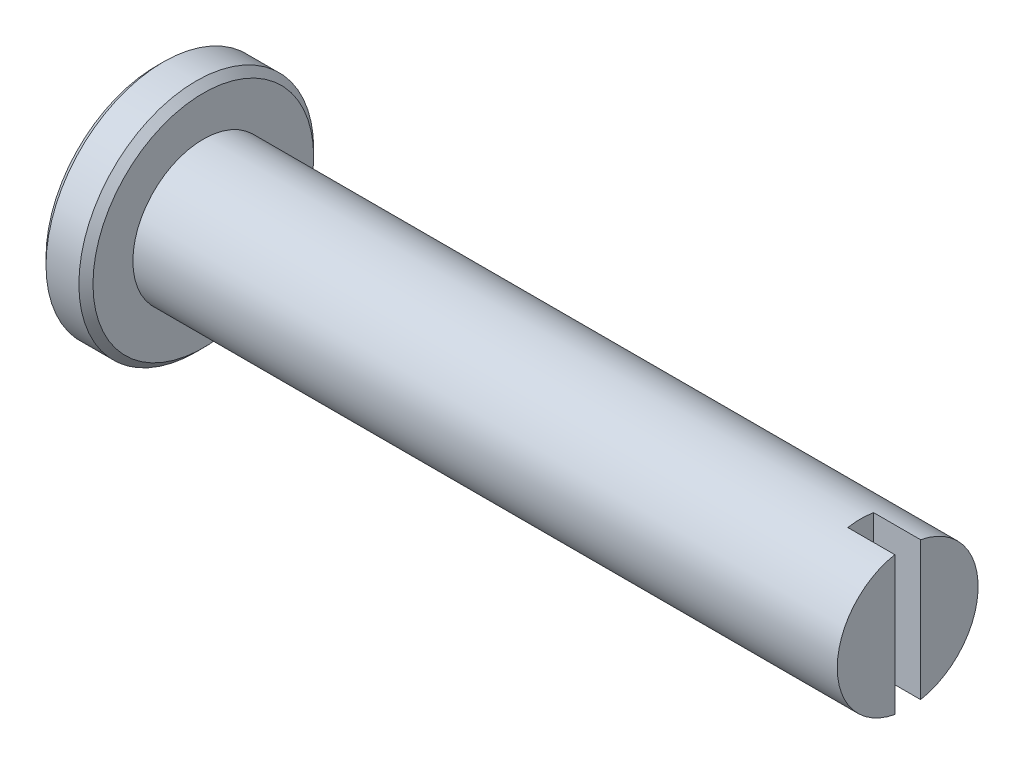
ISO-10303-21;
HEADER;
FILE_DESCRIPTION(('STEP AP214'),'2;1');
FILE_NAME('part.step','',(''),(''),'','','');
FILE_SCHEMA(('AUTOMOTIVE_DESIGN { 1 0 10303 214 1 1 1 1 }'));
ENDSEC;
DATA;
#1=APPLICATION_CONTEXT('core data for automotive mechanical design processes');
#2=APPLICATION_PROTOCOL_DEFINITION('international standard','automotive_design',2000,#1);
#3=PRODUCT_CONTEXT('',#1,'mechanical');
#4=PRODUCT('Part','Part','',(#3));
#5=PRODUCT_RELATED_PRODUCT_CATEGORY('part','',(#4));
#6=PRODUCT_DEFINITION_FORMATION('','',#4);
#7=PRODUCT_DEFINITION_CONTEXT('part definition',#1,'design');
#8=PRODUCT_DEFINITION('design','',#6,#7);
#9=PRODUCT_DEFINITION_SHAPE('','',#8);
#10=(LENGTH_UNIT() NAMED_UNIT(*) SI_UNIT(.MILLI.,.METRE.));
#11=(NAMED_UNIT(*) PLANE_ANGLE_UNIT() SI_UNIT($,.RADIAN.));
#12=(NAMED_UNIT(*) SI_UNIT($,.STERADIAN.) SOLID_ANGLE_UNIT());
#13=UNCERTAINTY_MEASURE_WITH_UNIT(LENGTH_MEASURE(1.E-05),#10,'distance_accuracy_value','');
#14=(GEOMETRIC_REPRESENTATION_CONTEXT(3) GLOBAL_UNCERTAINTY_ASSIGNED_CONTEXT((#13)) GLOBAL_UNIT_ASSIGNED_CONTEXT((#10,
#11,#12)) REPRESENTATION_CONTEXT('',''));
#15=CARTESIAN_POINT('',(0.,0.,0.));
#16=DIRECTION('',(0.,0.,1.));
#17=DIRECTION('',(1.,0.,0.));
#18=AXIS2_PLACEMENT_3D('',#15,#16,#17);
#19=CARTESIAN_POINT('',(32.,0.,0.));
#20=DIRECTION('',(-1.,0.,0.));
#21=DIRECTION('',(0.,0.,1.));
#22=AXIS2_PLACEMENT_3D('',#19,#20,#21);
#23=PLANE('',#22);
#24=CARTESIAN_POINT('',(32.,0.,0.));
#25=DIRECTION('',(-1.,0.,0.));
#26=DIRECTION('',(0.,0.,1.));
#27=AXIS2_PLACEMENT_3D('',#24,#25,#26);
#28=CIRCLE('',#27,3.);
#29=CARTESIAN_POINT('',(32.,2.94915242061172,-0.55));
#30=VERTEX_POINT('',#29);
#31=CARTESIAN_POINT('',(32.,-2.94915242061172,-0.55));
#32=VERTEX_POINT('',#31);
#33=EDGE_CURVE('E109',#30,#32,#28,.T.);
#34=ORIENTED_EDGE('',*,*,#33,.F.);
#35=DIRECTION('',(0.,1.,0.));
#36=VECTOR('',#35,1.);
#37=CARTESIAN_POINT('',(32.,-3.31864940053657,-0.55));
#38=LINE('',#37,#36);
#39=EDGE_CURVE('E102',#32,#30,#38,.T.);
#40=ORIENTED_EDGE('',*,*,#39,.F.);
#41=EDGE_LOOP('',(#34,#40));
#42=FACE_BOUND('',#41,.T.);
#43=ADVANCED_FACE('F50',(#42),#23,.F.);
#44=CARTESIAN_POINT('',(0.,0.,-5.));
#45=DIRECTION('',(1.,0.,0.));
#46=DIRECTION('',(0.,0.,-1.));
#47=AXIS2_PLACEMENT_3D('',#44,#45,#46);
#48=PLANE('',#47);
#49=CARTESIAN_POINT('',(0.,0.,0.));
#50=DIRECTION('',(1.,0.,0.));
#51=DIRECTION('',(0.,0.,-1.));
#52=AXIS2_PLACEMENT_3D('',#49,#50,#51);
#53=CIRCLE('',#52,4.7);
#54=CARTESIAN_POINT('',(0.,0.,-4.7));
#55=VERTEX_POINT('',#54);
#56=EDGE_CURVE('E132',#55,#55,#53,.F.);
#57=ORIENTED_EDGE('',*,*,#56,.T.);
#58=EDGE_LOOP('',(#57));
#59=FACE_BOUND('',#58,.T.);
#60=CARTESIAN_POINT('',(0.,0.,0.));
#61=DIRECTION('',(1.,0.,0.));
#62=DIRECTION('',(0.,0.,-1.));
#63=AXIS2_PLACEMENT_3D('',#60,#61,#62);
#64=CIRCLE('',#63,4.40000000000001);
#65=CARTESIAN_POINT('',(0.,0.,4.40000000000001));
#66=VERTEX_POINT('',#65);
#67=EDGE_CURVE('E129',#66,#66,#64,.T.);
#68=ORIENTED_EDGE('',*,*,#67,.T.);
#69=EDGE_LOOP('',(#68));
#70=FACE_BOUND('',#69,.T.);
#71=ADVANCED_FACE('F149',(#59,#70),#48,.F.);
#72=CARTESIAN_POINT('',(32.,-2.94915242061172,0.55));
#73=VERTEX_POINT('',#72);
#74=CARTESIAN_POINT('',(32.,2.94915242061172,0.55));
#75=VERTEX_POINT('',#74);
#76=EDGE_CURVE('E101',#73,#75,#28,.T.);
#77=ORIENTED_EDGE('',*,*,#76,.F.);
#78=DIRECTION('',(0.,-1.,0.));
#79=VECTOR('',#78,1.);
#80=CARTESIAN_POINT('',(32.,-3.31864940053657,0.55));
#81=LINE('',#80,#79);
#82=EDGE_CURVE('E92',#75,#73,#81,.T.);
#83=ORIENTED_EDGE('',*,*,#82,.F.);
#84=EDGE_LOOP('',(#77,#83));
#85=FACE_BOUND('',#84,.T.);
#86=ADVANCED_FACE('F100',(#85),#23,.F.);
#87=CARTESIAN_POINT('',(0.,0.,0.));
#88=DIRECTION('',(-1.,0.,0.));
#89=DIRECTION('',(0.,0.,1.));
#90=AXIS2_PLACEMENT_3D('',#87,#88,#89);
#91=CYLINDRICAL_SURFACE('',#90,3.);
#92=CARTESIAN_POINT('',(30.,0.,0.));
#93=DIRECTION('',(-1.,0.,0.));
#94=DIRECTION('',(0.,0.,1.));
#95=AXIS2_PLACEMENT_3D('',#92,#93,#94);
#96=CIRCLE('',#95,3.);
#97=CARTESIAN_POINT('',(30.,2.94915242061172,0.55));
#98=VERTEX_POINT('',#97);
#99=CARTESIAN_POINT('',(30.,2.94915242061172,-0.55));
#100=VERTEX_POINT('',#99);
#101=EDGE_CURVE('E70',#98,#100,#96,.T.);
#102=ORIENTED_EDGE('',*,*,#101,.T.);
#103=DIRECTION('',(-1.,0.,0.));
#104=VECTOR('',#103,1.);
#105=CARTESIAN_POINT('',(0.,2.94915242061172,-0.55));
#106=LINE('',#105,#104);
#107=EDGE_CURVE('E96',#100,#30,#106,.F.);
#108=ORIENTED_EDGE('',*,*,#107,.T.);
#109=ORIENTED_EDGE('',*,*,#33,.T.);
#110=DIRECTION('',(-1.,0.,0.));
#111=VECTOR('',#110,1.);
#112=CARTESIAN_POINT('',(0.,-2.94915242061172,-0.55));
#113=LINE('',#112,#111);
#114=CARTESIAN_POINT('',(30.,-2.94915242061172,-0.55));
#115=VERTEX_POINT('',#114);
#116=EDGE_CURVE('E121',#32,#115,#113,.T.);
#117=ORIENTED_EDGE('',*,*,#116,.T.);
#118=CARTESIAN_POINT('',(30.,-2.94915242061172,0.55));
#119=VERTEX_POINT('',#118);
#120=EDGE_CURVE('E113',#115,#119,#96,.T.);
#121=ORIENTED_EDGE('',*,*,#120,.T.);
#122=DIRECTION('',(-1.,0.,0.));
#123=VECTOR('',#122,1.);
#124=CARTESIAN_POINT('',(0.,-2.94915242061172,0.55));
#125=LINE('',#124,#123);
#126=EDGE_CURVE('E108',#119,#73,#125,.F.);
#127=ORIENTED_EDGE('',*,*,#126,.T.);
#128=ORIENTED_EDGE('',*,*,#76,.T.);
#129=DIRECTION('',(-1.,0.,0.));
#130=VECTOR('',#129,1.);
#131=CARTESIAN_POINT('',(0.,2.94915242061172,0.55));
#132=LINE('',#131,#130);
#133=EDGE_CURVE('E89',#75,#98,#132,.T.);
#134=ORIENTED_EDGE('',*,*,#133,.T.);
#135=EDGE_LOOP('',(#102,#108,#109,#117,#121,#127,#128,#134));
#136=FACE_BOUND('',#135,.T.);
#137=CARTESIAN_POINT('',(2.,0.,0.));
#138=DIRECTION('',(-1.,0.,0.));
#139=DIRECTION('',(0.,0.,1.));
#140=AXIS2_PLACEMENT_3D('',#137,#138,#139);
#141=CIRCLE('',#140,3.);
#142=CARTESIAN_POINT('',(2.,0.,3.));
#143=VERTEX_POINT('',#142);
#144=EDGE_CURVE('E110',#143,#143,#141,.T.);
#145=ORIENTED_EDGE('',*,*,#144,.F.);
#146=EDGE_LOOP('',(#145));
#147=FACE_BOUND('',#146,.T.);
#148=ADVANCED_FACE('F105',(#136,#147),#91,.T.);
#149=CARTESIAN_POINT('',(2.,0.,-3.));
#150=DIRECTION('',(-1.,0.,0.));
#151=DIRECTION('',(0.,0.,1.));
#152=AXIS2_PLACEMENT_3D('',#149,#150,#151);
#153=PLANE('',#152);
#154=CARTESIAN_POINT('',(2.,0.,0.));
#155=DIRECTION('',(-1.,0.,0.));
#156=DIRECTION('',(0.,0.,1.));
#157=AXIS2_PLACEMENT_3D('',#154,#155,#156);
#158=CIRCLE('',#157,4.7);
#159=CARTESIAN_POINT('',(2.,0.,4.7));
#160=VERTEX_POINT('',#159);
#161=EDGE_CURVE('E13',#160,#160,#158,.F.);
#162=ORIENTED_EDGE('',*,*,#161,.T.);
#163=EDGE_LOOP('',(#162));
#164=FACE_BOUND('',#163,.T.);
#165=ORIENTED_EDGE('',*,*,#144,.T.);
#166=EDGE_LOOP('',(#165));
#167=FACE_BOUND('',#166,.T.);
#168=ADVANCED_FACE('F187',(#164,#167),#153,.F.);
#169=CARTESIAN_POINT('',(0.,0.,0.));
#170=DIRECTION('',(-1.,0.,0.));
#171=DIRECTION('',(0.,0.,1.));
#172=AXIS2_PLACEMENT_3D('',#169,#170,#171);
#173=CYLINDRICAL_SURFACE('',#172,5.);
#174=CARTESIAN_POINT('',(0.300000000000001,0.,0.));
#175=DIRECTION('',(1.,0.,0.));
#176=DIRECTION('',(0.,0.,-1.));
#177=AXIS2_PLACEMENT_3D('',#174,#175,#176);
#178=CIRCLE('',#177,5.);
#179=CARTESIAN_POINT('',(0.300000000000001,0.,5.));
#180=VERTEX_POINT('',#179);
#181=EDGE_CURVE('E58',#180,#180,#178,.T.);
#182=CARTESIAN_POINT('',(1.7,0.,0.));
#183=DIRECTION('',(-1.,0.,0.));
#184=DIRECTION('',(0.,0.,1.));
#185=AXIS2_PLACEMENT_3D('',#182,#183,#184);
#186=CIRCLE('',#185,5.);
#187=CARTESIAN_POINT('',(1.7,0.,5.));
#188=VERTEX_POINT('',#187);
#189=EDGE_CURVE('E135',#188,#188,#186,.T.);
#190=CARTESIAN_POINT('',(0.300000000000001,0.,5.));
#191=CARTESIAN_POINT('',(0.314583333333334,0.,5.));
#192=CARTESIAN_POINT('',(0.329166666666667,0.,5.));
#193=CARTESIAN_POINT('',(0.358333333333334,0.,5.));
#194=CARTESIAN_POINT('',(0.372916666666667,0.,5.));
#195=CARTESIAN_POINT('',(0.402083333333334,0.,5.));
#196=CARTESIAN_POINT('',(0.416666666666667,0.,5.));
#197=CARTESIAN_POINT('',(0.445833333333334,0.,5.));
#198=CARTESIAN_POINT('',(0.460416666666667,0.,5.));
#199=CARTESIAN_POINT('',(0.489583333333334,0.,5.));
#200=CARTESIAN_POINT('',(0.504166666666667,0.,5.));
#201=CARTESIAN_POINT('',(0.533333333333334,0.,5.));
#202=CARTESIAN_POINT('',(0.547916666666667,0.,5.));
#203=CARTESIAN_POINT('',(0.577083333333334,0.,5.));
#204=CARTESIAN_POINT('',(0.591666666666667,0.,5.));
#205=CARTESIAN_POINT('',(0.620833333333334,0.,5.));
#206=CARTESIAN_POINT('',(0.635416666666667,0.,5.));
#207=CARTESIAN_POINT('',(0.664583333333334,0.,5.));
#208=CARTESIAN_POINT('',(0.679166666666667,0.,5.));
#209=CARTESIAN_POINT('',(0.708333333333334,0.,5.));
#210=CARTESIAN_POINT('',(0.722916666666667,0.,5.));
#211=CARTESIAN_POINT('',(0.752083333333334,0.,5.));
#212=CARTESIAN_POINT('',(0.766666666666667,0.,5.));
#213=CARTESIAN_POINT('',(0.795833333333334,0.,5.));
#214=CARTESIAN_POINT('',(0.810416666666667,0.,5.));
#215=CARTESIAN_POINT('',(0.839583333333334,0.,5.));
#216=CARTESIAN_POINT('',(0.854166666666667,0.,5.));
#217=CARTESIAN_POINT('',(0.883333333333334,0.,5.));
#218=CARTESIAN_POINT('',(0.897916666666667,0.,5.));
#219=CARTESIAN_POINT('',(0.927083333333334,0.,5.));
#220=CARTESIAN_POINT('',(0.941666666666667,0.,5.));
#221=CARTESIAN_POINT('',(0.970833333333334,0.,5.));
#222=CARTESIAN_POINT('',(0.985416666666667,0.,5.));
#223=CARTESIAN_POINT('',(1.01458333333333,0.,5.));
#224=CARTESIAN_POINT('',(1.02916666666667,0.,5.));
#225=CARTESIAN_POINT('',(1.05833333333333,0.,5.));
#226=CARTESIAN_POINT('',(1.07291666666667,0.,5.));
#227=CARTESIAN_POINT('',(1.10208333333333,0.,5.));
#228=CARTESIAN_POINT('',(1.11666666666667,0.,5.));
#229=CARTESIAN_POINT('',(1.14583333333333,0.,5.));
#230=CARTESIAN_POINT('',(1.16041666666667,0.,5.));
#231=CARTESIAN_POINT('',(1.18958333333333,0.,5.));
#232=CARTESIAN_POINT('',(1.20416666666667,0.,5.));
#233=CARTESIAN_POINT('',(1.23333333333333,0.,5.));
#234=CARTESIAN_POINT('',(1.24791666666667,0.,5.));
#235=CARTESIAN_POINT('',(1.27708333333333,0.,5.));
#236=CARTESIAN_POINT('',(1.29166666666667,0.,5.));
#237=CARTESIAN_POINT('',(1.32083333333333,0.,5.));
#238=CARTESIAN_POINT('',(1.33541666666667,0.,5.));
#239=CARTESIAN_POINT('',(1.36458333333333,0.,5.));
#240=CARTESIAN_POINT('',(1.37916666666667,0.,5.));
#241=CARTESIAN_POINT('',(1.40833333333333,0.,5.));
#242=CARTESIAN_POINT('',(1.42291666666667,0.,5.));
#243=CARTESIAN_POINT('',(1.45208333333333,0.,5.));
#244=CARTESIAN_POINT('',(1.46666666666667,0.,5.));
#245=CARTESIAN_POINT('',(1.49583333333333,0.,5.));
#246=CARTESIAN_POINT('',(1.51041666666667,0.,5.));
#247=CARTESIAN_POINT('',(1.53958333333333,0.,5.));
#248=CARTESIAN_POINT('',(1.55416666666667,0.,5.));
#249=CARTESIAN_POINT('',(1.58333333333333,0.,5.));
#250=CARTESIAN_POINT('',(1.59791666666667,0.,5.));
#251=CARTESIAN_POINT('',(1.62708333333333,0.,5.));
#252=CARTESIAN_POINT('',(1.64166666666667,0.,5.));
#253=CARTESIAN_POINT('',(1.67083333333333,0.,5.));
#254=CARTESIAN_POINT('',(1.68541666666667,0.,5.));
#255=CARTESIAN_POINT('',(1.7,0.,5.));
#256=B_SPLINE_CURVE_WITH_KNOTS('',3,(#190,#191,#192,#193,#194,#195,#196,#197,#198,#199,#200,
#201,#202,#203,#204,#205,#206,#207,#208,#209,#210,#211,#212,#213,#214,#215,#216,#217,#218,#219,
#220,#221,#222,#223,#224,#225,#226,#227,#228,#229,#230,#231,#232,#233,#234,#235,#236,#237,#238,
#239,#240,#241,#242,#243,#244,#245,#246,#247,#248,#249,#250,#251,#252,#253,#254,#255),
.UNSPECIFIED.,.F.,.F.,(4,2,2,2,2,2,2,2,2,2,2,2,2,2,2,2,2,2,2,2,2,2,2,2,2,2,2,2,2,2,2,2,4),(0.,
0.04375,0.0875,0.13125,0.175,0.21875,0.2625,0.30625,0.35,0.39375,0.4375,0.48125,0.525,0.56875,
0.6125,0.65625,0.7,0.74375,0.7875,0.831249999999999,0.874999999999999,0.918749999999999,0.9625,
1.00625,1.05,1.09375,1.1375,1.18125,1.225,1.26875,1.3125,1.35625,1.4),.UNSPECIFIED.);
#257=EDGE_CURVE('BSEAM140',#180,#188,#256,.T.);
#258=ORIENTED_EDGE('',*,*,#181,.T.);
#259=ORIENTED_EDGE('',*,*,#189,.T.);
#260=ORIENTED_EDGE('',*,*,#257,.T.);
#261=ORIENTED_EDGE('',*,*,#257,.F.);
#262=EDGE_LOOP('',(#258,#260,#259,#261));
#263=FACE_BOUND('',#262,.T.);
#264=ADVANCED_FACE('F140',(#263),#173,.T.);
#265=CARTESIAN_POINT('',(30.,-3.31864940053657,-0.55));
#266=DIRECTION('',(0.,0.,-1.));
#267=DIRECTION('',(-1.,0.,0.));
#268=AXIS2_PLACEMENT_3D('',#265,#266,#267);
#269=PLANE('',#268);
#270=ORIENTED_EDGE('',*,*,#39,.T.);
#271=ORIENTED_EDGE('',*,*,#107,.F.);
#272=DIRECTION('',(0.,1.,0.));
#273=VECTOR('',#272,1.);
#274=CARTESIAN_POINT('',(30.,-3.31864940053657,-0.55));
#275=LINE('',#274,#273);
#276=EDGE_CURVE('E115',#115,#100,#275,.T.);
#277=ORIENTED_EDGE('',*,*,#276,.F.);
#278=ORIENTED_EDGE('',*,*,#116,.F.);
#279=EDGE_LOOP('',(#270,#271,#277,#278));
#280=FACE_BOUND('',#279,.T.);
#281=ADVANCED_FACE('F174',(#280),#269,.F.);
#282=CARTESIAN_POINT('',(30.,-3.31864940053657,0.55));
#283=DIRECTION('',(0.,0.,1.));
#284=DIRECTION('',(1.,0.,0.));
#285=AXIS2_PLACEMENT_3D('',#282,#283,#284);
#286=PLANE('',#285);
#287=ORIENTED_EDGE('',*,*,#82,.T.);
#288=ORIENTED_EDGE('',*,*,#126,.F.);
#289=DIRECTION('',(0.,-1.,0.));
#290=VECTOR('',#289,1.);
#291=CARTESIAN_POINT('',(30.,-3.31864940053657,0.55));
#292=LINE('',#291,#290);
#293=EDGE_CURVE('E65',#98,#119,#292,.T.);
#294=ORIENTED_EDGE('',*,*,#293,.F.);
#295=ORIENTED_EDGE('',*,*,#133,.F.);
#296=EDGE_LOOP('',(#287,#288,#294,#295));
#297=FACE_BOUND('',#296,.T.);
#298=ADVANCED_FACE('F91',(#297),#286,.F.);
#299=CARTESIAN_POINT('',(30.,0.,0.));
#300=DIRECTION('',(-1.,0.,0.));
#301=DIRECTION('',(0.,0.,1.));
#302=AXIS2_PLACEMENT_3D('',#299,#300,#301);
#303=PLANE('',#302);
#304=ORIENTED_EDGE('',*,*,#293,.T.);
#305=ORIENTED_EDGE('',*,*,#120,.F.);
#306=ORIENTED_EDGE('',*,*,#276,.T.);
#307=ORIENTED_EDGE('',*,*,#101,.F.);
#308=EDGE_LOOP('',(#304,#305,#306,#307));
#309=FACE_BOUND('',#308,.T.);
#310=ADVANCED_FACE('F164',(#309),#303,.F.);
#311=CARTESIAN_POINT('',(2.,0.,0.));
#312=DIRECTION('',(-1.,0.,0.));
#313=DIRECTION('',(0.,0.,1.));
#314=AXIS2_PLACEMENT_3D('',#311,#312,#313);
#315=CYLINDRICAL_SURFACE('',#314,1.);
#316=CARTESIAN_POINT('',(1.96299091524472,0.,0.));
#317=DIRECTION('',(1.,0.,0.));
#318=DIRECTION('',(0.,0.,-1.));
#319=AXIS2_PLACEMENT_3D('',#316,#317,#318);
#320=CIRCLE('',#319,1.);
#321=CARTESIAN_POINT('',(1.96299091524472,0.,1.));
#322=VERTEX_POINT('',#321);
#323=EDGE_CURVE('E126',#322,#322,#320,.F.);
#324=ORIENTED_EDGE('',*,*,#323,.T.);
#325=EDGE_LOOP('',(#324));
#326=FACE_BOUND('',#325,.T.);
#327=CARTESIAN_POINT('',(2.,0.,0.));
#328=DIRECTION('',(-1.,0.,0.));
#329=DIRECTION('',(0.,0.,1.));
#330=AXIS2_PLACEMENT_3D('',#327,#328,#329);
#331=CIRCLE('',#330,1.);
#332=CARTESIAN_POINT('',(2.,0.,1.));
#333=VERTEX_POINT('',#332);
#334=EDGE_CURVE('E103',#333,#333,#331,.T.);
#335=ORIENTED_EDGE('',*,*,#334,.F.);
#336=EDGE_LOOP('',(#335));
#337=FACE_BOUND('',#336,.T.);
#338=ADVANCED_FACE('F161',(#326,#337),#315,.F.);
#339=CARTESIAN_POINT('',(2.,0.,0.));
#340=DIRECTION('',(-1.,0.,0.));
#341=DIRECTION('',(0.,0.,1.));
#342=AXIS2_PLACEMENT_3D('',#339,#340,#341);
#343=PLANE('',#342);
#344=ORIENTED_EDGE('',*,*,#334,.T.);
#345=EDGE_LOOP('',(#344));
#346=FACE_BOUND('',#345,.T.);
#347=ADVANCED_FACE('F157',(#346),#343,.T.);
#348=CARTESIAN_POINT('',(1.96299091524472,0.,0.));
#349=DIRECTION('',(-1.,0.,0.));
#350=DIRECTION('',(0.,0.,1.));
#351=AXIS2_PLACEMENT_3D('',#348,#349,#350);
#352=CONICAL_SURFACE('',#351,1.,1.0471975511966);
#353=CARTESIAN_POINT('',(0.,0.,4.40000000000001));
#354=CARTESIAN_POINT('',(0.0204478220337992,0.,4.36458333333334));
#355=CARTESIAN_POINT('',(0.0408956440675984,0.,4.32916666666668));
#356=CARTESIAN_POINT('',(0.0817912881351969,0.,4.25833333333334));
#357=CARTESIAN_POINT('',(0.102239110168996,0.,4.22291666666668));
#358=CARTESIAN_POINT('',(0.143134754236595,0.,4.15208333333334));
#359=CARTESIAN_POINT('',(0.163582576270394,0.,4.11666666666668));
#360=CARTESIAN_POINT('',(0.204478220337992,0.,4.04583333333334));
#361=CARTESIAN_POINT('',(0.224926042371791,0.,4.01041666666668));
#362=CARTESIAN_POINT('',(0.26582168643939,0.,3.93958333333334));
#363=CARTESIAN_POINT('',(0.286269508473189,0.,3.90416666666668));
#364=CARTESIAN_POINT('',(0.327165152540787,0.,3.83333333333334));
#365=CARTESIAN_POINT('',(0.347612974574587,0.,3.79791666666668));
#366=CARTESIAN_POINT('',(0.388508618642185,0.,3.72708333333334));
#367=CARTESIAN_POINT('',(0.408956440675984,0.,3.69166666666668));
#368=CARTESIAN_POINT('',(0.449852084743583,0.,3.62083333333334));
#369=CARTESIAN_POINT('',(0.470299906777382,0.,3.58541666666668));
#370=CARTESIAN_POINT('',(0.51119555084498,0.,3.51458333333334));
#371=CARTESIAN_POINT('',(0.53164337287878,0.,3.47916666666667));
#372=CARTESIAN_POINT('',(0.572539016946378,0.,3.40833333333334));
#373=CARTESIAN_POINT('',(0.592986838980177,0.,3.37291666666667));
#374=CARTESIAN_POINT('',(0.633882483047776,0.,3.30208333333334));
#375=CARTESIAN_POINT('',(0.654330305081575,0.,3.26666666666667));
#376=CARTESIAN_POINT('',(0.695225949149173,0.,3.19583333333334));
#377=CARTESIAN_POINT('',(0.715673771182973,0.,3.16041666666667));
#378=CARTESIAN_POINT('',(0.756569415250571,0.,3.08958333333334));
#379=CARTESIAN_POINT('',(0.77701723728437,0.,3.05416666666667));
#380=CARTESIAN_POINT('',(0.817912881351969,0.,2.98333333333334));
#381=CARTESIAN_POINT('',(0.838360703385768,0.,2.94791666666667));
#382=CARTESIAN_POINT('',(0.879256347453366,0.,2.87708333333334));
#383=CARTESIAN_POINT('',(0.899704169487166,0.,2.84166666666667));
#384=CARTESIAN_POINT('',(0.940599813554764,0.,2.77083333333334));
#385=CARTESIAN_POINT('',(0.961047635588563,0.,2.73541666666667));
#386=CARTESIAN_POINT('',(1.00194327965616,0.,2.66458333333334));
#387=CARTESIAN_POINT('',(1.02239110168996,0.,2.62916666666667));
#388=CARTESIAN_POINT('',(1.06328674575756,0.,2.55833333333334));
#389=CARTESIAN_POINT('',(1.08373456779136,0.,2.52291666666667));
#390=CARTESIAN_POINT('',(1.12463021185896,0.,2.45208333333334));
#391=CARTESIAN_POINT('',(1.14507803389276,0.,2.41666666666667));
#392=CARTESIAN_POINT('',(1.18597367796035,0.,2.34583333333334));
#393=CARTESIAN_POINT('',(1.20642149999415,0.,2.31041666666667));
#394=CARTESIAN_POINT('',(1.24731714406175,0.,2.23958333333334));
#395=CARTESIAN_POINT('',(1.26776496609555,0.,2.20416666666667));
#396=CARTESIAN_POINT('',(1.30866061016315,0.,2.13333333333334));
#397=CARTESIAN_POINT('',(1.32910843219695,0.,2.09791666666667));
#398=CARTESIAN_POINT('',(1.37000407626455,0.,2.02708333333334));
#399=CARTESIAN_POINT('',(1.39045189829835,0.,1.99166666666667));
#400=CARTESIAN_POINT('',(1.43134754236595,0.,1.92083333333334));
#401=CARTESIAN_POINT('',(1.45179536439974,0.,1.88541666666667));
#402=CARTESIAN_POINT('',(1.49269100846734,0.,1.81458333333334));
#403=CARTESIAN_POINT('',(1.51313883050114,0.,1.77916666666667));
#404=CARTESIAN_POINT('',(1.55403447456874,0.,1.70833333333334));
#405=CARTESIAN_POINT('',(1.57448229660254,0.,1.67291666666667));
#406=CARTESIAN_POINT('',(1.61537794067014,0.,1.60208333333334));
#407=CARTESIAN_POINT('',(1.63582576270394,0.,1.56666666666667));
#408=CARTESIAN_POINT('',(1.67672140677154,0.,1.49583333333334));
#409=CARTESIAN_POINT('',(1.69716922880534,0.,1.46041666666667));
#410=CARTESIAN_POINT('',(1.73806487287293,0.,1.38958333333333));
#411=CARTESIAN_POINT('',(1.75851269490673,0.,1.35416666666667));
#412=CARTESIAN_POINT('',(1.79940833897433,0.,1.28333333333333));
#413=CARTESIAN_POINT('',(1.81985616100813,0.,1.24791666666667));
#414=CARTESIAN_POINT('',(1.86075180507573,0.,1.17708333333333));
#415=CARTESIAN_POINT('',(1.88119962710953,0.,1.14166666666667));
#416=CARTESIAN_POINT('',(1.92209527117713,0.,1.07083333333333));
#417=CARTESIAN_POINT('',(1.94254309321093,0.,1.03541666666667));
#418=CARTESIAN_POINT('',(1.96299091524472,0.,1.));
#419=B_SPLINE_CURVE_WITH_KNOTS('',3,(#353,#354,#355,#356,#357,#358,#359,#360,#361,#362,#363,
#364,#365,#366,#367,#368,#369,#370,#371,#372,#373,#374,#375,#376,#377,#378,#379,#380,#381,#382,
#383,#384,#385,#386,#387,#388,#389,#390,#391,#392,#393,#394,#395,#396,#397,#398,#399,#400,#401,
#402,#403,#404,#405,#406,#407,#408,#409,#410,#411,#412,#413,#414,#415,#416,#417,#418),
.UNSPECIFIED.,.F.,.F.,(4,2,2,2,2,2,2,2,2,2,2,2,2,2,2,2,2,2,2,2,2,2,2,2,2,2,2,2,2,2,2,2,4),(0.,
0.122686932202796,0.245373864405592,0.368060796608387,0.490747728811182,0.613434661013978,
0.736121593216774,0.85880852541957,0.981495457622366,1.10418238982516,1.22686932202796,
1.34955625423075,1.47224318643355,1.59493011863634,1.71761705083914,1.84030398304194,
1.96299091524473,2.08567784744753,2.20836477965032,2.33105171185312,2.45373864405591,
2.57642557625871,2.69911250846151,2.8217994406643,2.9444863728671,3.06717330506989,
3.18986023727269,3.31254716947548,3.43523410167828,3.55792103388108,3.68060796608387,
3.80329489828667,3.92598183048946),.UNSPECIFIED.);
#420=EDGE_CURVE('BSEAM146',#66,#322,#419,.T.);
#421=ORIENTED_EDGE('',*,*,#67,.F.);
#422=ORIENTED_EDGE('',*,*,#323,.F.);
#423=ORIENTED_EDGE('',*,*,#420,.T.);
#424=ORIENTED_EDGE('',*,*,#420,.F.);
#425=EDGE_LOOP('',(#421,#423,#422,#424));
#426=FACE_BOUND('',#425,.T.);
#427=ADVANCED_FACE('F146',(#426),#352,.F.);
#428=CARTESIAN_POINT('',(0.,0.,0.));
#429=DIRECTION('',(1.,0.,0.));
#430=DIRECTION('',(0.,0.,-1.));
#431=AXIS2_PLACEMENT_3D('',#428,#429,#430);
#432=CONICAL_SURFACE('',#431,4.7,0.785398163397454);
#433=ORIENTED_EDGE('',*,*,#181,.F.);
#434=EDGE_LOOP('',(#433));
#435=FACE_BOUND('',#434,.T.);
#436=ORIENTED_EDGE('',*,*,#56,.F.);
#437=EDGE_LOOP('',(#436));
#438=FACE_BOUND('',#437,.T.);
#439=ADVANCED_FACE('F143',(#435,#438),#432,.T.);
#440=CARTESIAN_POINT('',(1.7,0.,0.));
#441=DIRECTION('',(-1.,0.,0.));
#442=DIRECTION('',(0.,0.,1.));
#443=AXIS2_PLACEMENT_3D('',#440,#441,#442);
#444=CONICAL_SURFACE('',#443,5.,0.785398163397443);
#445=CARTESIAN_POINT('',(2.,0.,4.7));
#446=CARTESIAN_POINT('',(1.996875,0.,4.703125));
#447=CARTESIAN_POINT('',(1.99375,0.,4.70625));
#448=CARTESIAN_POINT('',(1.9875,0.,4.7125));
#449=CARTESIAN_POINT('',(1.984375,0.,4.715625));
#450=CARTESIAN_POINT('',(1.978125,0.,4.721875));
#451=CARTESIAN_POINT('',(1.975,0.,4.725));
#452=CARTESIAN_POINT('',(1.96875,0.,4.73125));
#453=CARTESIAN_POINT('',(1.965625,0.,4.734375));
#454=CARTESIAN_POINT('',(1.959375,0.,4.740625));
#455=CARTESIAN_POINT('',(1.95625,0.,4.74375));
#456=CARTESIAN_POINT('',(1.95,0.,4.75));
#457=CARTESIAN_POINT('',(1.946875,0.,4.753125));
#458=CARTESIAN_POINT('',(1.940625,0.,4.759375));
#459=CARTESIAN_POINT('',(1.9375,0.,4.7625));
#460=CARTESIAN_POINT('',(1.93125,0.,4.76875));
#461=CARTESIAN_POINT('',(1.928125,0.,4.771875));
#462=CARTESIAN_POINT('',(1.921875,0.,4.778125));
#463=CARTESIAN_POINT('',(1.91875,0.,4.78125));
#464=CARTESIAN_POINT('',(1.9125,0.,4.7875));
#465=CARTESIAN_POINT('',(1.909375,0.,4.790625));
#466=CARTESIAN_POINT('',(1.903125,0.,4.796875));
#467=CARTESIAN_POINT('',(1.9,0.,4.8));
#468=CARTESIAN_POINT('',(1.89375,0.,4.80625));
#469=CARTESIAN_POINT('',(1.890625,0.,4.809375));
#470=CARTESIAN_POINT('',(1.884375,0.,4.815625));
#471=CARTESIAN_POINT('',(1.88125,0.,4.81875));
#472=CARTESIAN_POINT('',(1.875,0.,4.825));
#473=CARTESIAN_POINT('',(1.871875,0.,4.828125));
#474=CARTESIAN_POINT('',(1.865625,0.,4.834375));
#475=CARTESIAN_POINT('',(1.8625,0.,4.8375));
#476=CARTESIAN_POINT('',(1.85625,0.,4.84375));
#477=CARTESIAN_POINT('',(1.853125,0.,4.846875));
#478=CARTESIAN_POINT('',(1.846875,0.,4.853125));
#479=CARTESIAN_POINT('',(1.84375,0.,4.85625));
#480=CARTESIAN_POINT('',(1.8375,0.,4.8625));
#481=CARTESIAN_POINT('',(1.834375,0.,4.865625));
#482=CARTESIAN_POINT('',(1.828125,0.,4.871875));
#483=CARTESIAN_POINT('',(1.825,0.,4.875));
#484=CARTESIAN_POINT('',(1.81875,0.,4.88125));
#485=CARTESIAN_POINT('',(1.815625,0.,4.884375));
#486=CARTESIAN_POINT('',(1.809375,0.,4.890625));
#487=CARTESIAN_POINT('',(1.80625,0.,4.89375));
#488=CARTESIAN_POINT('',(1.8,0.,4.9));
#489=CARTESIAN_POINT('',(1.796875,0.,4.903125));
#490=CARTESIAN_POINT('',(1.790625,0.,4.909375));
#491=CARTESIAN_POINT('',(1.7875,0.,4.9125));
#492=CARTESIAN_POINT('',(1.78125,0.,4.91875));
#493=CARTESIAN_POINT('',(1.778125,0.,4.921875));
#494=CARTESIAN_POINT('',(1.771875,0.,4.928125));
#495=CARTESIAN_POINT('',(1.76875,0.,4.93125));
#496=CARTESIAN_POINT('',(1.7625,0.,4.9375));
#497=CARTESIAN_POINT('',(1.759375,0.,4.940625));
#498=CARTESIAN_POINT('',(1.753125,0.,4.946875));
#499=CARTESIAN_POINT('',(1.75,0.,4.95));
#500=CARTESIAN_POINT('',(1.74375,0.,4.95625));
#501=CARTESIAN_POINT('',(1.740625,0.,4.959375));
#502=CARTESIAN_POINT('',(1.734375,0.,4.965625));
#503=CARTESIAN_POINT('',(1.73125,0.,4.96875));
#504=CARTESIAN_POINT('',(1.725,0.,4.975));
#505=CARTESIAN_POINT('',(1.721875,0.,4.978125));
#506=CARTESIAN_POINT('',(1.715625,0.,4.984375));
#507=CARTESIAN_POINT('',(1.7125,0.,4.9875));
#508=CARTESIAN_POINT('',(1.70625,0.,4.99375));
#509=CARTESIAN_POINT('',(1.703125,0.,4.996875));
#510=CARTESIAN_POINT('',(1.7,0.,5.));
#511=B_SPLINE_CURVE_WITH_KNOTS('',3,(#445,#446,#447,#448,#449,#450,#451,#452,#453,#454,#455,
#456,#457,#458,#459,#460,#461,#462,#463,#464,#465,#466,#467,#468,#469,#470,#471,#472,#473,#474,
#475,#476,#477,#478,#479,#480,#481,#482,#483,#484,#485,#486,#487,#488,#489,#490,#491,#492,#493,
#494,#495,#496,#497,#498,#499,#500,#501,#502,#503,#504,#505,#506,#507,#508,#509,#510),
.UNSPECIFIED.,.F.,.F.,(4,2,2,2,2,2,2,2,2,2,2,2,2,2,2,2,2,2,2,2,2,2,2,2,2,2,2,2,2,2,2,2,4),(0.,
0.0132582521472478,0.0265165042944954,0.0397747564417432,0.0530330085889907,0.0662912607362386,
0.0795495128834861,0.0928077650307338,0.106066017177981,0.11932426932523,0.132582521472477,
0.145840773619725,0.159099025766973,0.17235727791422,0.185615530061468,0.198873782208716,
0.212132034355963,0.225390286503211,0.238648538650459,0.251906790797707,0.265165042944955,
0.278423295092202,0.29168154723945,0.304939799386698,0.318198051533945,0.331456303681193,
0.344714555828441,0.357972807975688,0.371231060122937,0.384489312270184,0.397747564417432,
0.41100581656468,0.424264068711927),.UNSPECIFIED.);
#512=EDGE_CURVE('BSEAM52',#160,#188,#511,.T.);
#513=ORIENTED_EDGE('',*,*,#161,.F.);
#514=ORIENTED_EDGE('',*,*,#189,.F.);
#515=ORIENTED_EDGE('',*,*,#512,.T.);
#516=ORIENTED_EDGE('',*,*,#512,.F.);
#517=EDGE_LOOP('',(#513,#515,#514,#516));
#518=FACE_BOUND('',#517,.T.);
#519=ADVANCED_FACE('F52',(#518),#444,.T.);
#520=CLOSED_SHELL('',(#43,#71,#86,#148,#168,#264,#281,#298,#310,#338,#347,#427,#439,#519));
#521=MANIFOLD_SOLID_BREP('B2',#520);
#522=ADVANCED_BREP_SHAPE_REPRESENTATION('',(#18,#521),#14);
#523=SHAPE_DEFINITION_REPRESENTATION(#9,#522);
ENDSEC;
END-ISO-10303-21;
